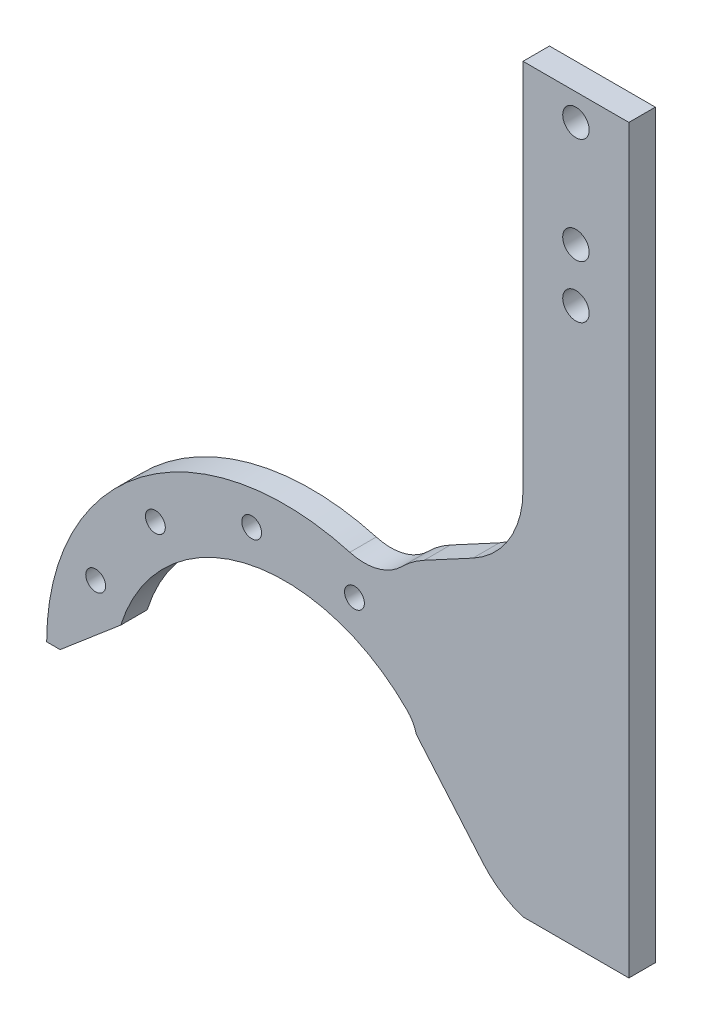
ISO-10303-21;
HEADER;
FILE_DESCRIPTION(('STEP AP214'),'2;1');
FILE_NAME('part.step','',(''),(''),'','','');
FILE_SCHEMA(('AUTOMOTIVE_DESIGN { 1 0 10303 214 1 1 1 1 }'));
ENDSEC;
DATA;
#1=APPLICATION_CONTEXT('core data for automotive mechanical design processes');
#2=APPLICATION_PROTOCOL_DEFINITION('international standard','automotive_design',2000,#1);
#3=PRODUCT_CONTEXT('',#1,'mechanical');
#4=PRODUCT('Part','Part','',(#3));
#5=PRODUCT_RELATED_PRODUCT_CATEGORY('part','',(#4));
#6=PRODUCT_DEFINITION_FORMATION('','',#4);
#7=PRODUCT_DEFINITION_CONTEXT('part definition',#1,'design');
#8=PRODUCT_DEFINITION('design','',#6,#7);
#9=PRODUCT_DEFINITION_SHAPE('','',#8);
#10=(LENGTH_UNIT() NAMED_UNIT(*) SI_UNIT(.MILLI.,.METRE.));
#11=(NAMED_UNIT(*) PLANE_ANGLE_UNIT() SI_UNIT($,.RADIAN.));
#12=(NAMED_UNIT(*) SI_UNIT($,.STERADIAN.) SOLID_ANGLE_UNIT());
#13=UNCERTAINTY_MEASURE_WITH_UNIT(LENGTH_MEASURE(1.E-05),#10,'distance_accuracy_value','');
#14=(GEOMETRIC_REPRESENTATION_CONTEXT(3) GLOBAL_UNCERTAINTY_ASSIGNED_CONTEXT((#13)) GLOBAL_UNIT_ASSIGNED_CONTEXT((#10,
#11,#12)) REPRESENTATION_CONTEXT('',''));
#15=CARTESIAN_POINT('',(0.,0.,0.));
#16=DIRECTION('',(0.,0.,1.));
#17=DIRECTION('',(1.,0.,0.));
#18=AXIS2_PLACEMENT_3D('',#15,#16,#17);
#19=CARTESIAN_POINT('',(-44.45,-76.2,6.35));
#20=DIRECTION('',(0.,0.,-1.));
#21=DIRECTION('',(-1.,0.,0.));
#22=AXIS2_PLACEMENT_3D('',#19,#20,#21);
#23=CYLINDRICAL_SURFACE('',#22,57.15);
#24=CARTESIAN_POINT('',(-44.45,-76.2,6.35));
#25=DIRECTION('',(0.,0.,1.));
#26=DIRECTION('',(1.,0.,0.));
#27=AXIS2_PLACEMENT_3D('',#24,#25,#26);
#28=CIRCLE('',#27,57.15);
#29=CARTESIAN_POINT('',(-28.8636363636364,-21.2164772991485,6.35));
#30=VERTEX_POINT('',#29);
#31=CARTESIAN_POINT('',(-101.6,-76.2,6.35));
#32=VERTEX_POINT('',#31);
#33=EDGE_CURVE('E185',#30,#32,#28,.T.);
#34=ORIENTED_EDGE('',*,*,#33,.F.);
#35=DIRECTION('',(0.,0.,-1.));
#36=VECTOR('',#35,1.);
#37=CARTESIAN_POINT('',(-28.8636363636364,-21.2164772991485,6.35));
#38=LINE('',#37,#36);
#39=CARTESIAN_POINT('',(-28.8636363636364,-21.2164772991485,0.));
#40=VERTEX_POINT('',#39);
#41=EDGE_CURVE('E233',#30,#40,#38,.T.);
#42=ORIENTED_EDGE('',*,*,#41,.T.);
#43=CARTESIAN_POINT('',(-44.45,-76.2,0.));
#44=DIRECTION('',(0.,0.,1.));
#45=DIRECTION('',(1.,0.,0.));
#46=AXIS2_PLACEMENT_3D('',#43,#44,#45);
#47=CIRCLE('',#46,57.15);
#48=CARTESIAN_POINT('',(-101.6,-76.2,0.));
#49=VERTEX_POINT('',#48);
#50=EDGE_CURVE('E175',#40,#49,#47,.T.);
#51=ORIENTED_EDGE('',*,*,#50,.T.);
#52=DIRECTION('',(0.,0.,-1.));
#53=VECTOR('',#52,1.);
#54=CARTESIAN_POINT('',(-101.6,-76.2,6.35));
#55=LINE('',#54,#53);
#56=EDGE_CURVE('E201',#32,#49,#55,.T.);
#57=ORIENTED_EDGE('',*,*,#56,.F.);
#58=EDGE_LOOP('',(#34,#42,#51,#57));
#59=FACE_BOUND('',#58,.T.);
#60=ADVANCED_FACE('F41',(#59),#23,.T.);
#61=CARTESIAN_POINT('',(1.33226762955019E-13,-76.1999999999998,6.35));
#62=DIRECTION('',(0.,1.,0.));
#63=DIRECTION('',(-1.,0.,0.));
#64=AXIS2_PLACEMENT_3D('',#61,#62,#63);
#65=PLANE('',#64);
#66=DIRECTION('',(1.,0.,0.));
#67=VECTOR('',#66,1.);
#68=CARTESIAN_POINT('',(1.33226762955019E-13,-76.1999999999998,0.));
#69=LINE('',#68,#67);
#70=CARTESIAN_POINT('',(-98.3709117966785,-76.2,0.));
#71=VERTEX_POINT('',#70);
#72=EDGE_CURVE('E178',#49,#71,#69,.T.);
#73=ORIENTED_EDGE('',*,*,#72,.T.);
#74=DIRECTION('',(0.,0.,1.));
#75=VECTOR('',#74,1.);
#76=CARTESIAN_POINT('',(-98.3709117966785,-76.2,6.35));
#77=LINE('',#76,#75);
#78=CARTESIAN_POINT('',(-98.3709117966785,-76.2,6.35));
#79=VERTEX_POINT('',#78);
#80=EDGE_CURVE('E216',#71,#79,#77,.T.);
#81=ORIENTED_EDGE('',*,*,#80,.T.);
#82=DIRECTION('',(1.,0.,0.));
#83=VECTOR('',#82,1.);
#84=CARTESIAN_POINT('',(1.33226762955019E-13,-76.1999999999998,6.35));
#85=LINE('',#84,#83);
#86=EDGE_CURVE('E187',#32,#79,#85,.T.);
#87=ORIENTED_EDGE('',*,*,#86,.F.);
#88=ORIENTED_EDGE('',*,*,#56,.T.);
#89=EDGE_LOOP('',(#73,#81,#87,#88));
#90=FACE_BOUND('',#89,.T.);
#91=ADVANCED_FACE('F272',(#90),#65,.F.);
#92=CARTESIAN_POINT('',(-44.45,-76.2,6.35));
#93=DIRECTION('',(0.,0.,-1.));
#94=DIRECTION('',(-1.,0.,0.));
#95=AXIS2_PLACEMENT_3D('',#92,#93,#94);
#96=CYLINDRICAL_SURFACE('',#95,41.275);
#97=CARTESIAN_POINT('',(-44.45,-76.2,6.35));
#98=DIRECTION('',(0.,0.,1.));
#99=DIRECTION('',(1.,0.,0.));
#100=AXIS2_PLACEMENT_3D('',#97,#98,#99);
#101=CIRCLE('',#100,41.275);
#102=CARTESIAN_POINT('',(-15.08125,-47.1982388735183,6.35));
#103=VERTEX_POINT('',#102);
#104=CARTESIAN_POINT('',(-83.8304411998213,-63.8385083461818,6.35));
#105=VERTEX_POINT('',#104);
#106=EDGE_CURVE('E191',#103,#105,#101,.T.);
#107=ORIENTED_EDGE('',*,*,#106,.T.);
#108=DIRECTION('',(0.,0.,-1.));
#109=VECTOR('',#108,1.);
#110=CARTESIAN_POINT('',(-83.8304411998213,-63.8385083461818,6.35));
#111=LINE('',#110,#109);
#112=CARTESIAN_POINT('',(-83.8304411998213,-63.8385083461818,0.));
#113=VERTEX_POINT('',#112);
#114=EDGE_CURVE('E211',#105,#113,#111,.T.);
#115=ORIENTED_EDGE('',*,*,#114,.T.);
#116=CARTESIAN_POINT('',(-44.45,-76.2,0.));
#117=DIRECTION('',(0.,0.,1.));
#118=DIRECTION('',(1.,0.,0.));
#119=AXIS2_PLACEMENT_3D('',#116,#117,#118);
#120=CIRCLE('',#119,41.275);
#121=CARTESIAN_POINT('',(-15.08125,-47.1982388735183,0.));
#122=VERTEX_POINT('',#121);
#123=EDGE_CURVE('E188',#122,#113,#120,.T.);
#124=ORIENTED_EDGE('',*,*,#123,.F.);
#125=DIRECTION('',(0.,0.,-1.));
#126=VECTOR('',#125,1.);
#127=CARTESIAN_POINT('',(-15.08125,-47.1982388735183,6.35));
#128=LINE('',#127,#126);
#129=EDGE_CURVE('E204',#122,#103,#128,.F.);
#130=ORIENTED_EDGE('',*,*,#129,.T.);
#131=EDGE_LOOP('',(#107,#115,#124,#130));
#132=FACE_BOUND('',#131,.T.);
#133=ADVANCED_FACE('F278',(#132),#96,.F.);
#134=CARTESIAN_POINT('',(0.,0.,6.35));
#135=DIRECTION('',(0.,0.,1.));
#136=DIRECTION('',(1.,0.,0.));
#137=AXIS2_PLACEMENT_3D('',#134,#135,#136);
#138=PLANE('',#137);
#139=CARTESIAN_POINT('',(-89.8423971973198,-57.5547367272793,6.35));
#140=DIRECTION('',(0.,0.,-1.));
#141=DIRECTION('',(-1.,0.,0.));
#142=AXIS2_PLACEMENT_3D('',#139,#140,#141);
#143=CIRCLE('',#142,2.38125);
#144=CARTESIAN_POINT('',(-92.2236471973198,-57.5547367272793,6.35));
#145=VERTEX_POINT('',#144);
#146=EDGE_CURVE('E169',#145,#145,#143,.T.);
#147=ORIENTED_EDGE('',*,*,#146,.T.);
#148=EDGE_LOOP('',(#147));
#149=FACE_BOUND('',#148,.T.);
#150=CARTESIAN_POINT('',(-75.5178748819948,-38.2144406893221,6.35));
#151=DIRECTION('',(0.,0.,-1.));
#152=DIRECTION('',(-1.,0.,0.));
#153=AXIS2_PLACEMENT_3D('',#150,#151,#152);
#154=CIRCLE('',#153,2.38125);
#155=CARTESIAN_POINT('',(-77.8991248819948,-38.2144406893221,6.35));
#156=VERTEX_POINT('',#155);
#157=EDGE_CURVE('E421',#156,#156,#154,.T.);
#158=ORIENTED_EDGE('',*,*,#157,.T.);
#159=EDGE_LOOP('',(#158));
#160=FACE_BOUND('',#159,.T.);
#161=CARTESIAN_POINT('',(-52.4067923326307,-27.7768131820746,6.35));
#162=DIRECTION('',(0.,0.,-1.));
#163=DIRECTION('',(-1.,0.,0.));
#164=AXIS2_PLACEMENT_3D('',#161,#162,#163);
#165=CIRCLE('',#164,2.38125);
#166=CARTESIAN_POINT('',(-54.7880423326307,-27.7768131820746,6.35));
#167=VERTEX_POINT('',#166);
#168=EDGE_CURVE('E415',#167,#167,#165,.T.);
#169=ORIENTED_EDGE('',*,*,#168,.T.);
#170=EDGE_LOOP('',(#169));
#171=FACE_BOUND('',#170,.T.);
#172=CARTESIAN_POINT('',(-27.7415300063891,-30.0595340693126,6.35));
#173=DIRECTION('',(0.,0.,-1.));
#174=DIRECTION('',(-1.,0.,0.));
#175=AXIS2_PLACEMENT_3D('',#172,#173,#174);
#176=CIRCLE('',#175,2.38125);
#177=CARTESIAN_POINT('',(-30.1227800063891,-30.0595340693126,6.35));
#178=VERTEX_POINT('',#177);
#179=EDGE_CURVE('E409',#178,#178,#176,.T.);
#180=ORIENTED_EDGE('',*,*,#179,.T.);
#181=EDGE_LOOP('',(#180));
#182=FACE_BOUND('',#181,.T.);
#183=DIRECTION('',(0.880453129608866,0.47413319495892,0.));
#184=VECTOR('',#183,1.);
#185=CARTESIAN_POINT('',(3.3478618441859,-6.21689320543561,6.35));
#186=LINE('',#185,#184);
#187=CARTESIAN_POINT('',(0.67868483676089,-7.65427286811398,6.35));
#188=VERTEX_POINT('',#187);
#189=CARTESIAN_POINT('',(-11.0475519394319,-13.9689736972325,6.35));
#190=VERTEX_POINT('',#189);
#191=EDGE_CURVE('E242',#188,#190,#186,.F.);
#192=ORIENTED_EDGE('',*,*,#191,.T.);
#193=CARTESIAN_POINT('',(-0.208867102671021,-34.0961322400912,6.35));
#194=DIRECTION('',(0.,0.,1.));
#195=DIRECTION('',(1.,0.,0.));
#196=AXIS2_PLACEMENT_3D('',#193,#194,#195);
#197=CIRCLE('',#196,22.86);
#198=CARTESIAN_POINT('',(-16.4031668223825,-17.9615651065064,6.35));
#199=VERTEX_POINT('',#198);
#200=EDGE_CURVE('E252',#190,#199,#197,.T.);
#201=ORIENTED_EDGE('',*,*,#200,.T.);
#202=CARTESIAN_POINT('',(-25.4,-8.99791669895934,6.35));
#203=DIRECTION('',(0.,0.,1.));
#204=DIRECTION('',(1.,0.,0.));
#205=AXIS2_PLACEMENT_3D('',#202,#203,#204);
#206=CIRCLE('',#205,12.7);
#207=EDGE_CURVE('E238',#199,#30,#206,.F.);
#208=ORIENTED_EDGE('',*,*,#207,.T.);
#209=ORIENTED_EDGE('',*,*,#33,.T.);
#210=ORIENTED_EDGE('',*,*,#86,.T.);
#211=DIRECTION('',(-0.761885232314504,-0.647712044647214,0.));
#212=VECTOR('',#211,1.);
#213=CARTESIAN_POINT('',(-3.66628963914725,4.31255209245857,6.35));
#214=LINE('',#213,#212);
#215=EDGE_CURVE('E218',#79,#105,#214,.F.);
#216=ORIENTED_EDGE('',*,*,#215,.T.);
#217=ORIENTED_EDGE('',*,*,#106,.F.);
#218=CARTESIAN_POINT('',(-20.955,-52.9985910988147,6.35));
#219=DIRECTION('',(0.,0.,1.));
#220=DIRECTION('',(1.,0.,0.));
#221=AXIS2_PLACEMENT_3D('',#218,#219,#220);
#222=CIRCLE('',#221,8.255);
#223=CARTESIAN_POINT('',(-12.9401023140592,-51.0221194739485,6.35));
#224=VERTEX_POINT('',#223);
#225=EDGE_CURVE('E208',#103,#224,#222,.F.);
#226=ORIENTED_EDGE('',*,*,#225,.T.);
#227=DIRECTION('',(-0.649395163568103,0.760451130273575,0.));
#228=VECTOR('',#227,1.);
#229=CARTESIAN_POINT('',(-32.6794999165494,-27.9069993439247,6.35));
#230=LINE('',#229,#228);
#231=CARTESIAN_POINT('',(3.13325716915403,-69.844255935735,6.35));
#232=VERTEX_POINT('',#231);
#233=EDGE_CURVE('E224',#224,#232,#230,.F.);
#234=ORIENTED_EDGE('',*,*,#233,.T.);
#235=CARTESIAN_POINT('',(19.0685106040368,-56.2361802831654,6.35));
#236=DIRECTION('',(0.,0.,1.));
#237=DIRECTION('',(1.,0.,0.));
#238=AXIS2_PLACEMENT_3D('',#235,#236,#237);
#239=CIRCLE('',#238,20.955);
#240=CARTESIAN_POINT('',(12.7,-76.2,6.35));
#241=VERTEX_POINT('',#240);
#242=EDGE_CURVE('E231',#232,#241,#239,.T.);
#243=ORIENTED_EDGE('',*,*,#242,.T.);
#244=DIRECTION('',(-1.,0.,0.));
#245=VECTOR('',#244,1.);
#246=CARTESIAN_POINT('',(12.7,-76.2,6.35));
#247=LINE('',#246,#245);
#248=CARTESIAN_POINT('',(38.1,-76.2,6.35));
#249=VERTEX_POINT('',#248);
#250=EDGE_CURVE('E377',#249,#241,#247,.T.);
#251=ORIENTED_EDGE('',*,*,#250,.F.);
#252=DIRECTION('',(0.,-1.,0.));
#253=VECTOR('',#252,1.);
#254=CARTESIAN_POINT('',(38.1,101.6,6.35));
#255=LINE('',#254,#253);
#256=CARTESIAN_POINT('',(38.1,101.6,6.35));
#257=VERTEX_POINT('',#256);
#258=EDGE_CURVE('E379',#257,#249,#255,.T.);
#259=ORIENTED_EDGE('',*,*,#258,.F.);
#260=DIRECTION('',(-1.,0.,0.));
#261=VECTOR('',#260,1.);
#262=CARTESIAN_POINT('',(12.7,101.6,6.35));
#263=LINE('',#262,#261);
#264=CARTESIAN_POINT('',(12.7,101.6,6.35));
#265=VERTEX_POINT('',#264);
#266=EDGE_CURVE('E176',#257,#265,#263,.T.);
#267=ORIENTED_EDGE('',*,*,#266,.T.);
#268=DIRECTION('',(0.,-1.,0.));
#269=VECTOR('',#268,1.);
#270=CARTESIAN_POINT('',(12.7,101.6,6.35));
#271=LINE('',#270,#269);
#272=CARTESIAN_POINT('',(12.7,12.4728856747447,6.35));
#273=VERTEX_POINT('',#272);
#274=EDGE_CURVE('E154',#265,#273,#271,.T.);
#275=ORIENTED_EDGE('',*,*,#274,.T.);
#276=CARTESIAN_POINT('',(-10.16,12.4728856747447,6.35));
#277=DIRECTION('',(0.,0.,1.));
#278=DIRECTION('',(1.,0.,0.));
#279=AXIS2_PLACEMENT_3D('',#276,#277,#278);
#280=CIRCLE('',#279,22.86);
#281=EDGE_CURVE('E49',#273,#188,#280,.F.);
#282=ORIENTED_EDGE('',*,*,#281,.T.);
#283=EDGE_LOOP('',(#192,#201,#208,#209,#210,#216,#217,#226,#234,#243,#251,#259,#267,#275,#282));
#284=FACE_BOUND('',#283,.T.);
#285=CARTESIAN_POINT('',(25.4,57.15,6.35));
#286=DIRECTION('',(0.,0.,-1.));
#287=DIRECTION('',(-1.,0.,0.));
#288=AXIS2_PLACEMENT_3D('',#285,#286,#287);
#289=CIRCLE('',#288,3.175);
#290=CARTESIAN_POINT('',(22.225,57.15,6.35));
#291=VERTEX_POINT('',#290);
#292=EDGE_CURVE('E401',#291,#291,#289,.T.);
#293=ORIENTED_EDGE('',*,*,#292,.T.);
#294=EDGE_LOOP('',(#293));
#295=FACE_BOUND('',#294,.T.);
#296=CARTESIAN_POINT('',(25.4,69.8500000000001,6.35));
#297=DIRECTION('',(0.,0.,-1.));
#298=DIRECTION('',(-1.,0.,0.));
#299=AXIS2_PLACEMENT_3D('',#296,#297,#298);
#300=CIRCLE('',#299,3.175);
#301=CARTESIAN_POINT('',(22.225,69.8500000000001,6.35));
#302=VERTEX_POINT('',#301);
#303=EDGE_CURVE('E396',#302,#302,#300,.T.);
#304=ORIENTED_EDGE('',*,*,#303,.T.);
#305=EDGE_LOOP('',(#304));
#306=FACE_BOUND('',#305,.T.);
#307=CARTESIAN_POINT('',(25.4,95.2500000000001,6.35));
#308=DIRECTION('',(0.,0.,-1.));
#309=DIRECTION('',(-1.,0.,0.));
#310=AXIS2_PLACEMENT_3D('',#307,#308,#309);
#311=CIRCLE('',#310,3.175);
#312=CARTESIAN_POINT('',(22.225,95.2500000000001,6.35));
#313=VERTEX_POINT('',#312);
#314=EDGE_CURVE('E387',#313,#313,#311,.T.);
#315=ORIENTED_EDGE('',*,*,#314,.T.);
#316=EDGE_LOOP('',(#315));
#317=FACE_BOUND('',#316,.T.);
#318=ADVANCED_FACE('F256',(#149,#160,#171,#182,#284,#295,#306,#317),#138,.T.);
#319=CARTESIAN_POINT('',(0.,0.,0.));
#320=DIRECTION('',(0.,0.,1.));
#321=DIRECTION('',(1.,0.,0.));
#322=AXIS2_PLACEMENT_3D('',#319,#320,#321);
#323=PLANE('',#322);
#324=CARTESIAN_POINT('',(-89.8423971973198,-57.5547367272793,0.));
#325=DIRECTION('',(0.,0.,-1.));
#326=DIRECTION('',(-1.,0.,0.));
#327=AXIS2_PLACEMENT_3D('',#324,#325,#326);
#328=CIRCLE('',#327,2.38125);
#329=CARTESIAN_POINT('',(-92.2236471973198,-57.5547367272793,0.));
#330=VERTEX_POINT('',#329);
#331=EDGE_CURVE('E427',#330,#330,#328,.T.);
#332=ORIENTED_EDGE('',*,*,#331,.F.);
#333=EDGE_LOOP('',(#332));
#334=FACE_BOUND('',#333,.T.);
#335=CARTESIAN_POINT('',(-75.5178748819948,-38.2144406893221,0.));
#336=DIRECTION('',(0.,0.,-1.));
#337=DIRECTION('',(-1.,0.,0.));
#338=AXIS2_PLACEMENT_3D('',#335,#336,#337);
#339=CIRCLE('',#338,2.38125);
#340=CARTESIAN_POINT('',(-77.8991248819948,-38.2144406893221,0.));
#341=VERTEX_POINT('',#340);
#342=EDGE_CURVE('E424',#341,#341,#339,.T.);
#343=ORIENTED_EDGE('',*,*,#342,.F.);
#344=EDGE_LOOP('',(#343));
#345=FACE_BOUND('',#344,.T.);
#346=CARTESIAN_POINT('',(-52.4067923326307,-27.7768131820746,0.));
#347=DIRECTION('',(0.,0.,-1.));
#348=DIRECTION('',(-1.,0.,0.));
#349=AXIS2_PLACEMENT_3D('',#346,#347,#348);
#350=CIRCLE('',#349,2.38125);
#351=CARTESIAN_POINT('',(-54.7880423326307,-27.7768131820746,0.));
#352=VERTEX_POINT('',#351);
#353=EDGE_CURVE('E418',#352,#352,#350,.T.);
#354=ORIENTED_EDGE('',*,*,#353,.F.);
#355=EDGE_LOOP('',(#354));
#356=FACE_BOUND('',#355,.T.);
#357=CARTESIAN_POINT('',(-27.7415300063891,-30.0595340693126,0.));
#358=DIRECTION('',(0.,0.,-1.));
#359=DIRECTION('',(-1.,0.,0.));
#360=AXIS2_PLACEMENT_3D('',#357,#358,#359);
#361=CIRCLE('',#360,2.38125);
#362=CARTESIAN_POINT('',(-30.1227800063891,-30.0595340693126,0.));
#363=VERTEX_POINT('',#362);
#364=EDGE_CURVE('E412',#363,#363,#361,.T.);
#365=ORIENTED_EDGE('',*,*,#364,.F.);
#366=EDGE_LOOP('',(#365));
#367=FACE_BOUND('',#366,.T.);
#368=CARTESIAN_POINT('',(-25.4,-8.99791669895934,0.));
#369=DIRECTION('',(0.,0.,1.));
#370=DIRECTION('',(1.,0.,0.));
#371=AXIS2_PLACEMENT_3D('',#368,#369,#370);
#372=CIRCLE('',#371,12.7);
#373=CARTESIAN_POINT('',(-16.4031668223825,-17.9615651065064,0.));
#374=VERTEX_POINT('',#373);
#375=EDGE_CURVE('E236',#40,#374,#372,.T.);
#376=ORIENTED_EDGE('',*,*,#375,.T.);
#377=CARTESIAN_POINT('',(-0.208867102671021,-34.0961322400912,0.));
#378=DIRECTION('',(0.,0.,1.));
#379=DIRECTION('',(1.,0.,0.));
#380=AXIS2_PLACEMENT_3D('',#377,#378,#379);
#381=CIRCLE('',#380,22.86);
#382=CARTESIAN_POINT('',(-11.0475519394319,-13.9689736972325,0.));
#383=VERTEX_POINT('',#382);
#384=EDGE_CURVE('E247',#374,#383,#381,.F.);
#385=ORIENTED_EDGE('',*,*,#384,.T.);
#386=DIRECTION('',(-0.880453129608866,-0.47413319495892,0.));
#387=VECTOR('',#386,1.);
#388=CARTESIAN_POINT('',(-14.7967177940331,-15.9879386202859,0.));
#389=LINE('',#388,#387);
#390=CARTESIAN_POINT('',(0.678684836760897,-7.65427286811397,0.));
#391=VERTEX_POINT('',#390);
#392=EDGE_CURVE('E240',#383,#391,#389,.F.);
#393=ORIENTED_EDGE('',*,*,#392,.T.);
#394=CARTESIAN_POINT('',(-10.16,12.4728856747447,0.));
#395=DIRECTION('',(0.,0.,1.));
#396=DIRECTION('',(1.,0.,0.));
#397=AXIS2_PLACEMENT_3D('',#394,#395,#396);
#398=CIRCLE('',#397,22.86);
#399=CARTESIAN_POINT('',(12.7,12.4728856747447,0.));
#400=VERTEX_POINT('',#399);
#401=EDGE_CURVE('E11',#391,#400,#398,.T.);
#402=ORIENTED_EDGE('',*,*,#401,.T.);
#403=DIRECTION('',(0.,-1.,0.));
#404=VECTOR('',#403,1.);
#405=CARTESIAN_POINT('',(12.7,101.6,0.));
#406=LINE('',#405,#404);
#407=CARTESIAN_POINT('',(12.7,101.6,0.));
#408=VERTEX_POINT('',#407);
#409=EDGE_CURVE('E152',#408,#400,#406,.T.);
#410=ORIENTED_EDGE('',*,*,#409,.F.);
#411=DIRECTION('',(-1.,0.,0.));
#412=VECTOR('',#411,1.);
#413=CARTESIAN_POINT('',(12.7,101.6,0.));
#414=LINE('',#413,#412);
#415=CARTESIAN_POINT('',(38.1,101.6,0.));
#416=VERTEX_POINT('',#415);
#417=EDGE_CURVE('E165',#416,#408,#414,.T.);
#418=ORIENTED_EDGE('',*,*,#417,.F.);
#419=DIRECTION('',(0.,-1.,0.));
#420=VECTOR('',#419,1.);
#421=CARTESIAN_POINT('',(38.1,101.6,0.));
#422=LINE('',#421,#420);
#423=CARTESIAN_POINT('',(38.1,-76.2,0.));
#424=VERTEX_POINT('',#423);
#425=EDGE_CURVE('E385',#416,#424,#422,.T.);
#426=ORIENTED_EDGE('',*,*,#425,.T.);
#427=DIRECTION('',(-1.,0.,0.));
#428=VECTOR('',#427,1.);
#429=CARTESIAN_POINT('',(12.7,-76.2,0.));
#430=LINE('',#429,#428);
#431=CARTESIAN_POINT('',(12.7,-76.2,0.));
#432=VERTEX_POINT('',#431);
#433=EDGE_CURVE('E381',#424,#432,#430,.T.);
#434=ORIENTED_EDGE('',*,*,#433,.T.);
#435=CARTESIAN_POINT('',(19.0685106040368,-56.2361802831654,0.));
#436=DIRECTION('',(0.,0.,1.));
#437=DIRECTION('',(1.,0.,0.));
#438=AXIS2_PLACEMENT_3D('',#435,#436,#437);
#439=CIRCLE('',#438,20.955);
#440=CARTESIAN_POINT('',(3.13325716915403,-69.844255935735,0.));
#441=VERTEX_POINT('',#440);
#442=EDGE_CURVE('E227',#432,#441,#439,.F.);
#443=ORIENTED_EDGE('',*,*,#442,.T.);
#444=DIRECTION('',(0.649395163568103,-0.760451130273575,0.));
#445=VECTOR('',#444,1.);
#446=CARTESIAN_POINT('',(8.56081101436363,-76.2,0.));
#447=LINE('',#446,#445);
#448=CARTESIAN_POINT('',(-12.9401023140592,-51.0221194739485,0.));
#449=VERTEX_POINT('',#448);
#450=EDGE_CURVE('E220',#441,#449,#447,.F.);
#451=ORIENTED_EDGE('',*,*,#450,.T.);
#452=CARTESIAN_POINT('',(-20.955,-52.9985910988147,0.));
#453=DIRECTION('',(0.,0.,1.));
#454=DIRECTION('',(1.,0.,0.));
#455=AXIS2_PLACEMENT_3D('',#452,#453,#454);
#456=CIRCLE('',#455,8.255);
#457=EDGE_CURVE('E206',#449,#122,#456,.T.);
#458=ORIENTED_EDGE('',*,*,#457,.T.);
#459=ORIENTED_EDGE('',*,*,#123,.T.);
#460=DIRECTION('',(0.761885232314504,0.647712044647214,0.));
#461=VECTOR('',#460,1.);
#462=CARTESIAN_POINT('',(-83.8304411998213,-63.8385083461818,0.));
#463=LINE('',#462,#461);
#464=EDGE_CURVE('E214',#113,#71,#463,.F.);
#465=ORIENTED_EDGE('',*,*,#464,.T.);
#466=ORIENTED_EDGE('',*,*,#72,.F.);
#467=ORIENTED_EDGE('',*,*,#50,.F.);
#468=EDGE_LOOP('',(#376,#385,#393,#402,#410,#418,#426,#434,#443,#451,#458,#459,#465,#466,#467));
#469=FACE_BOUND('',#468,.T.);
#470=CARTESIAN_POINT('',(25.4,57.15,0.));
#471=DIRECTION('',(0.,0.,-1.));
#472=DIRECTION('',(-1.,0.,0.));
#473=AXIS2_PLACEMENT_3D('',#470,#471,#472);
#474=CIRCLE('',#473,3.175);
#475=CARTESIAN_POINT('',(22.225,57.15,0.));
#476=VERTEX_POINT('',#475);
#477=EDGE_CURVE('E158',#476,#476,#474,.T.);
#478=ORIENTED_EDGE('',*,*,#477,.F.);
#479=EDGE_LOOP('',(#478));
#480=FACE_BOUND('',#479,.T.);
#481=CARTESIAN_POINT('',(25.4,69.8500000000001,0.));
#482=DIRECTION('',(0.,0.,-1.));
#483=DIRECTION('',(-1.,0.,0.));
#484=AXIS2_PLACEMENT_3D('',#481,#482,#483);
#485=CIRCLE('',#484,3.175);
#486=CARTESIAN_POINT('',(22.225,69.8500000000001,0.));
#487=VERTEX_POINT('',#486);
#488=EDGE_CURVE('E398',#487,#487,#485,.T.);
#489=ORIENTED_EDGE('',*,*,#488,.F.);
#490=EDGE_LOOP('',(#489));
#491=FACE_BOUND('',#490,.T.);
#492=CARTESIAN_POINT('',(25.4,95.2500000000001,0.));
#493=DIRECTION('',(0.,0.,-1.));
#494=DIRECTION('',(-1.,0.,0.));
#495=AXIS2_PLACEMENT_3D('',#492,#493,#494);
#496=CIRCLE('',#495,3.175);
#497=CARTESIAN_POINT('',(22.225,95.2500000000001,0.));
#498=VERTEX_POINT('',#497);
#499=EDGE_CURVE('E391',#498,#498,#496,.T.);
#500=ORIENTED_EDGE('',*,*,#499,.F.);
#501=EDGE_LOOP('',(#500));
#502=FACE_BOUND('',#501,.T.);
#503=ADVANCED_FACE('F162',(#334,#345,#356,#367,#469,#480,#491,#502),#323,.F.);
#504=CARTESIAN_POINT('',(-20.955,-52.9985910988147,6.35));
#505=DIRECTION('',(0.,0.,-1.));
#506=DIRECTION('',(-1.,0.,0.));
#507=AXIS2_PLACEMENT_3D('',#504,#505,#506);
#508=CYLINDRICAL_SURFACE('',#507,8.255);
#509=ORIENTED_EDGE('',*,*,#457,.F.);
#510=DIRECTION('',(0.,0.,-1.));
#511=VECTOR('',#510,1.);
#512=CARTESIAN_POINT('',(-12.9401023140592,-51.0221194739485,6.35));
#513=LINE('',#512,#511);
#514=EDGE_CURVE('E222',#449,#224,#513,.F.);
#515=ORIENTED_EDGE('',*,*,#514,.T.);
#516=ORIENTED_EDGE('',*,*,#225,.F.);
#517=ORIENTED_EDGE('',*,*,#129,.F.);
#518=EDGE_LOOP('',(#509,#515,#516,#517));
#519=FACE_BOUND('',#518,.T.);
#520=ADVANCED_FACE('F284',(#519),#508,.F.);
#521=CARTESIAN_POINT('',(-83.8304411998213,-63.8385083461818,6.35));
#522=DIRECTION('',(-0.647712044647214,0.761885232314504,0.));
#523=DIRECTION('',(0.,0.,-1.));
#524=AXIS2_PLACEMENT_3D('',#521,#522,#523);
#525=PLANE('',#524);
#526=ORIENTED_EDGE('',*,*,#215,.F.);
#527=ORIENTED_EDGE('',*,*,#80,.F.);
#528=ORIENTED_EDGE('',*,*,#464,.F.);
#529=ORIENTED_EDGE('',*,*,#114,.F.);
#530=EDGE_LOOP('',(#526,#527,#528,#529));
#531=FACE_BOUND('',#530,.T.);
#532=ADVANCED_FACE('F287',(#531),#525,.F.);
#533=CARTESIAN_POINT('',(8.56081101436363,-76.2,6.35));
#534=DIRECTION('',(0.760451130273575,0.649395163568103,0.));
#535=DIRECTION('',(0.,0.,-1.));
#536=AXIS2_PLACEMENT_3D('',#533,#534,#535);
#537=PLANE('',#536);
#538=ORIENTED_EDGE('',*,*,#450,.F.);
#539=DIRECTION('',(0.,0.,-1.));
#540=VECTOR('',#539,1.);
#541=CARTESIAN_POINT('',(3.13325716915403,-69.844255935735,6.35));
#542=LINE('',#541,#540);
#543=EDGE_CURVE('E229',#441,#232,#542,.F.);
#544=ORIENTED_EDGE('',*,*,#543,.T.);
#545=ORIENTED_EDGE('',*,*,#233,.F.);
#546=ORIENTED_EDGE('',*,*,#514,.F.);
#547=EDGE_LOOP('',(#538,#544,#545,#546));
#548=FACE_BOUND('',#547,.T.);
#549=ADVANCED_FACE('F295',(#548),#537,.F.);
#550=CARTESIAN_POINT('',(19.0685106040368,-56.2361802831654,6.35));
#551=DIRECTION('',(0.,0.,-1.));
#552=DIRECTION('',(-1.,0.,0.));
#553=AXIS2_PLACEMENT_3D('',#550,#551,#552);
#554=CYLINDRICAL_SURFACE('',#553,20.955);
#555=ORIENTED_EDGE('',*,*,#242,.F.);
#556=ORIENTED_EDGE('',*,*,#543,.F.);
#557=ORIENTED_EDGE('',*,*,#442,.F.);
#558=DIRECTION('',(0.,0.,-1.));
#559=VECTOR('',#558,1.);
#560=CARTESIAN_POINT('',(12.7,-76.2,6.35));
#561=LINE('',#560,#559);
#562=EDGE_CURVE('E193',#241,#432,#561,.T.);
#563=ORIENTED_EDGE('',*,*,#562,.F.);
#564=EDGE_LOOP('',(#555,#556,#557,#563));
#565=FACE_BOUND('',#564,.T.);
#566=ADVANCED_FACE('F302',(#565),#554,.T.);
#567=CARTESIAN_POINT('',(-25.4,-8.99791669895934,6.35));
#568=DIRECTION('',(0.,0.,-1.));
#569=DIRECTION('',(-1.,0.,0.));
#570=AXIS2_PLACEMENT_3D('',#567,#568,#569);
#571=CYLINDRICAL_SURFACE('',#570,12.7);
#572=ORIENTED_EDGE('',*,*,#207,.F.);
#573=DIRECTION('',(0.,0.,-1.));
#574=VECTOR('',#573,1.);
#575=CARTESIAN_POINT('',(-16.4031668223825,-17.9615651065064,6.35));
#576=LINE('',#575,#574);
#577=EDGE_CURVE('E244',#199,#374,#576,.T.);
#578=ORIENTED_EDGE('',*,*,#577,.T.);
#579=ORIENTED_EDGE('',*,*,#375,.F.);
#580=ORIENTED_EDGE('',*,*,#41,.F.);
#581=EDGE_LOOP('',(#572,#578,#579,#580));
#582=FACE_BOUND('',#581,.T.);
#583=ADVANCED_FACE('F306',(#582),#571,.F.);
#584=CARTESIAN_POINT('',(12.7,101.6,0.));
#585=DIRECTION('',(0.,1.,0.));
#586=DIRECTION('',(0.,0.,1.));
#587=AXIS2_PLACEMENT_3D('',#584,#585,#586);
#588=PLANE('',#587);
#589=DIRECTION('',(0.,0.,-1.));
#590=VECTOR('',#589,1.);
#591=CARTESIAN_POINT('',(12.7,101.6,6.35));
#592=LINE('',#591,#590);
#593=EDGE_CURVE('E149',#265,#408,#592,.T.);
#594=ORIENTED_EDGE('',*,*,#593,.F.);
#595=ORIENTED_EDGE('',*,*,#266,.F.);
#596=DIRECTION('',(0.,0.,-1.));
#597=VECTOR('',#596,1.);
#598=CARTESIAN_POINT('',(38.1,101.6,6.35));
#599=LINE('',#598,#597);
#600=EDGE_CURVE('E173',#257,#416,#599,.T.);
#601=ORIENTED_EDGE('',*,*,#600,.T.);
#602=ORIENTED_EDGE('',*,*,#417,.T.);
#603=EDGE_LOOP('',(#594,#595,#601,#602));
#604=FACE_BOUND('',#603,.T.);
#605=ADVANCED_FACE('F171',(#604),#588,.T.);
#606=CARTESIAN_POINT('',(12.7,-76.2,6.35));
#607=DIRECTION('',(0.,-1.,0.));
#608=DIRECTION('',(0.,0.,-1.));
#609=AXIS2_PLACEMENT_3D('',#606,#607,#608);
#610=PLANE('',#609);
#611=ORIENTED_EDGE('',*,*,#433,.F.);
#612=DIRECTION('',(0.,0.,-1.));
#613=VECTOR('',#612,1.);
#614=CARTESIAN_POINT('',(38.1,-76.2,6.35));
#615=LINE('',#614,#613);
#616=EDGE_CURVE('E180',#249,#424,#615,.T.);
#617=ORIENTED_EDGE('',*,*,#616,.F.);
#618=ORIENTED_EDGE('',*,*,#250,.T.);
#619=ORIENTED_EDGE('',*,*,#562,.T.);
#620=EDGE_LOOP('',(#611,#617,#618,#619));
#621=FACE_BOUND('',#620,.T.);
#622=ADVANCED_FACE('F335',(#621),#610,.T.);
#623=CARTESIAN_POINT('',(38.1,101.6,6.35));
#624=DIRECTION('',(1.,0.,0.));
#625=DIRECTION('',(0.,1.,0.));
#626=AXIS2_PLACEMENT_3D('',#623,#624,#625);
#627=PLANE('',#626);
#628=ORIENTED_EDGE('',*,*,#425,.F.);
#629=ORIENTED_EDGE('',*,*,#600,.F.);
#630=ORIENTED_EDGE('',*,*,#258,.T.);
#631=ORIENTED_EDGE('',*,*,#616,.T.);
#632=EDGE_LOOP('',(#628,#629,#630,#631));
#633=FACE_BOUND('',#632,.T.);
#634=ADVANCED_FACE('F333',(#633),#627,.T.);
#635=CARTESIAN_POINT('',(25.4,95.2500000000001,6.35));
#636=DIRECTION('',(0.,0.,-1.));
#637=DIRECTION('',(-1.,0.,0.));
#638=AXIS2_PLACEMENT_3D('',#635,#636,#637);
#639=CYLINDRICAL_SURFACE('',#638,3.175);
#640=ORIENTED_EDGE('',*,*,#314,.F.);
#641=EDGE_LOOP('',(#640));
#642=FACE_BOUND('',#641,.T.);
#643=ORIENTED_EDGE('',*,*,#499,.T.);
#644=EDGE_LOOP('',(#643));
#645=FACE_BOUND('',#644,.T.);
#646=ADVANCED_FACE('F329',(#642,#645),#639,.F.);
#647=CARTESIAN_POINT('',(25.4,69.8500000000001,6.35));
#648=DIRECTION('',(0.,0.,-1.));
#649=DIRECTION('',(-1.,0.,0.));
#650=AXIS2_PLACEMENT_3D('',#647,#648,#649);
#651=CYLINDRICAL_SURFACE('',#650,3.175);
#652=ORIENTED_EDGE('',*,*,#303,.F.);
#653=EDGE_LOOP('',(#652));
#654=FACE_BOUND('',#653,.T.);
#655=ORIENTED_EDGE('',*,*,#488,.T.);
#656=EDGE_LOOP('',(#655));
#657=FACE_BOUND('',#656,.T.);
#658=ADVANCED_FACE('F322',(#654,#657),#651,.F.);
#659=CARTESIAN_POINT('',(25.4,57.15,6.35));
#660=DIRECTION('',(0.,0.,-1.));
#661=DIRECTION('',(-1.,0.,0.));
#662=AXIS2_PLACEMENT_3D('',#659,#660,#661);
#663=CYLINDRICAL_SURFACE('',#662,3.175);
#664=ORIENTED_EDGE('',*,*,#292,.F.);
#665=EDGE_LOOP('',(#664));
#666=FACE_BOUND('',#665,.T.);
#667=ORIENTED_EDGE('',*,*,#477,.T.);
#668=EDGE_LOOP('',(#667));
#669=FACE_BOUND('',#668,.T.);
#670=ADVANCED_FACE('F317',(#666,#669),#663,.F.);
#671=CARTESIAN_POINT('',(12.7,101.6,6.35));
#672=DIRECTION('',(1.,0.,0.));
#673=DIRECTION('',(0.,1.,0.));
#674=AXIS2_PLACEMENT_3D('',#671,#672,#673);
#675=PLANE('',#674);
#676=ORIENTED_EDGE('',*,*,#409,.T.);
#677=DIRECTION('',(0.,0.,-1.));
#678=VECTOR('',#677,1.);
#679=CARTESIAN_POINT('',(12.7,12.4728856747447,6.35));
#680=LINE('',#679,#678);
#681=EDGE_CURVE('E254',#400,#273,#680,.F.);
#682=ORIENTED_EDGE('',*,*,#681,.T.);
#683=ORIENTED_EDGE('',*,*,#274,.F.);
#684=ORIENTED_EDGE('',*,*,#593,.T.);
#685=EDGE_LOOP('',(#676,#682,#683,#684));
#686=FACE_BOUND('',#685,.T.);
#687=ADVANCED_FACE('F151',(#686),#675,.F.);
#688=CARTESIAN_POINT('',(-14.7967177940331,-15.9879386202859,6.35));
#689=DIRECTION('',(0.47413319495892,-0.880453129608866,0.));
#690=DIRECTION('',(0.,0.,-1.));
#691=AXIS2_PLACEMENT_3D('',#688,#689,#690);
#692=PLANE('',#691);
#693=ORIENTED_EDGE('',*,*,#392,.F.);
#694=DIRECTION('',(0.,0.,-1.));
#695=VECTOR('',#694,1.);
#696=CARTESIAN_POINT('',(-11.0475519394319,-13.9689736972325,6.35));
#697=LINE('',#696,#695);
#698=EDGE_CURVE('E63',#383,#190,#697,.F.);
#699=ORIENTED_EDGE('',*,*,#698,.T.);
#700=ORIENTED_EDGE('',*,*,#191,.F.);
#701=DIRECTION('',(0.,0.,1.));
#702=VECTOR('',#701,1.);
#703=CARTESIAN_POINT('',(0.67868483676089,-7.65427286811398,6.35));
#704=LINE('',#703,#702);
#705=EDGE_CURVE('E249',#188,#391,#704,.F.);
#706=ORIENTED_EDGE('',*,*,#705,.T.);
#707=EDGE_LOOP('',(#693,#699,#700,#706));
#708=FACE_BOUND('',#707,.T.);
#709=ADVANCED_FACE('F259',(#708),#692,.F.);
#710=CARTESIAN_POINT('',(-0.208867102671021,-34.0961322400912,6.35));
#711=DIRECTION('',(0.,0.,-1.));
#712=DIRECTION('',(-1.,0.,0.));
#713=AXIS2_PLACEMENT_3D('',#710,#711,#712);
#714=CYLINDRICAL_SURFACE('',#713,22.86);
#715=ORIENTED_EDGE('',*,*,#200,.F.);
#716=ORIENTED_EDGE('',*,*,#698,.F.);
#717=ORIENTED_EDGE('',*,*,#384,.F.);
#718=ORIENTED_EDGE('',*,*,#577,.F.);
#719=EDGE_LOOP('',(#715,#716,#717,#718));
#720=FACE_BOUND('',#719,.T.);
#721=ADVANCED_FACE('F262',(#720),#714,.T.);
#722=CARTESIAN_POINT('',(-10.16,12.4728856747447,6.35));
#723=DIRECTION('',(0.,0.,-1.));
#724=DIRECTION('',(-1.,0.,0.));
#725=AXIS2_PLACEMENT_3D('',#722,#723,#724);
#726=CYLINDRICAL_SURFACE('',#725,22.86);
#727=ORIENTED_EDGE('',*,*,#401,.F.);
#728=ORIENTED_EDGE('',*,*,#705,.F.);
#729=ORIENTED_EDGE('',*,*,#281,.F.);
#730=ORIENTED_EDGE('',*,*,#681,.F.);
#731=EDGE_LOOP('',(#727,#728,#729,#730));
#732=FACE_BOUND('',#731,.T.);
#733=ADVANCED_FACE('F43',(#732),#726,.F.);
#734=CARTESIAN_POINT('',(-27.7415300063891,-30.0595340693126,6.35));
#735=DIRECTION('',(0.,0.,-1.));
#736=DIRECTION('',(-1.,0.,0.));
#737=AXIS2_PLACEMENT_3D('',#734,#735,#736);
#738=CYLINDRICAL_SURFACE('',#737,2.38125);
#739=ORIENTED_EDGE('',*,*,#179,.F.);
#740=EDGE_LOOP('',(#739));
#741=FACE_BOUND('',#740,.T.);
#742=ORIENTED_EDGE('',*,*,#364,.T.);
#743=EDGE_LOOP('',(#742));
#744=FACE_BOUND('',#743,.T.);
#745=ADVANCED_FACE('F261',(#741,#744),#738,.F.);
#746=CARTESIAN_POINT('',(-52.4067923326307,-27.7768131820746,6.35));
#747=DIRECTION('',(0.,0.,-1.));
#748=DIRECTION('',(-1.,0.,0.));
#749=AXIS2_PLACEMENT_3D('',#746,#747,#748);
#750=CYLINDRICAL_SURFACE('',#749,2.38125);
#751=ORIENTED_EDGE('',*,*,#168,.F.);
#752=EDGE_LOOP('',(#751));
#753=FACE_BOUND('',#752,.T.);
#754=ORIENTED_EDGE('',*,*,#353,.T.);
#755=EDGE_LOOP('',(#754));
#756=FACE_BOUND('',#755,.T.);
#757=ADVANCED_FACE('F267',(#753,#756),#750,.F.);
#758=CARTESIAN_POINT('',(-75.5178748819948,-38.2144406893221,6.35));
#759=DIRECTION('',(0.,0.,-1.));
#760=DIRECTION('',(-1.,0.,0.));
#761=AXIS2_PLACEMENT_3D('',#758,#759,#760);
#762=CYLINDRICAL_SURFACE('',#761,2.38125);
#763=ORIENTED_EDGE('',*,*,#157,.F.);
#764=EDGE_LOOP('',(#763));
#765=FACE_BOUND('',#764,.T.);
#766=ORIENTED_EDGE('',*,*,#342,.T.);
#767=EDGE_LOOP('',(#766));
#768=FACE_BOUND('',#767,.T.);
#769=ADVANCED_FACE('F437',(#765,#768),#762,.F.);
#770=CARTESIAN_POINT('',(-89.8423971973198,-57.5547367272793,6.35));
#771=DIRECTION('',(0.,0.,-1.));
#772=DIRECTION('',(-1.,0.,0.));
#773=AXIS2_PLACEMENT_3D('',#770,#771,#772);
#774=CYLINDRICAL_SURFACE('',#773,2.38125);
#775=ORIENTED_EDGE('',*,*,#146,.F.);
#776=EDGE_LOOP('',(#775));
#777=FACE_BOUND('',#776,.T.);
#778=ORIENTED_EDGE('',*,*,#331,.T.);
#779=EDGE_LOOP('',(#778));
#780=FACE_BOUND('',#779,.T.);
#781=ADVANCED_FACE('F434',(#777,#780),#774,.F.);
#782=CLOSED_SHELL('',(#60,#91,#133,#318,#503,#520,#532,#549,#566,#583,#605,#622,#634,#646,#658,
#670,#687,#709,#721,#733,#745,#757,#769,#781));
#783=MANIFOLD_SOLID_BREP('B2',#782);
#784=ADVANCED_BREP_SHAPE_REPRESENTATION('',(#18,#783),#14);
#785=SHAPE_DEFINITION_REPRESENTATION(#9,#784);
ENDSEC;
END-ISO-10303-21;
